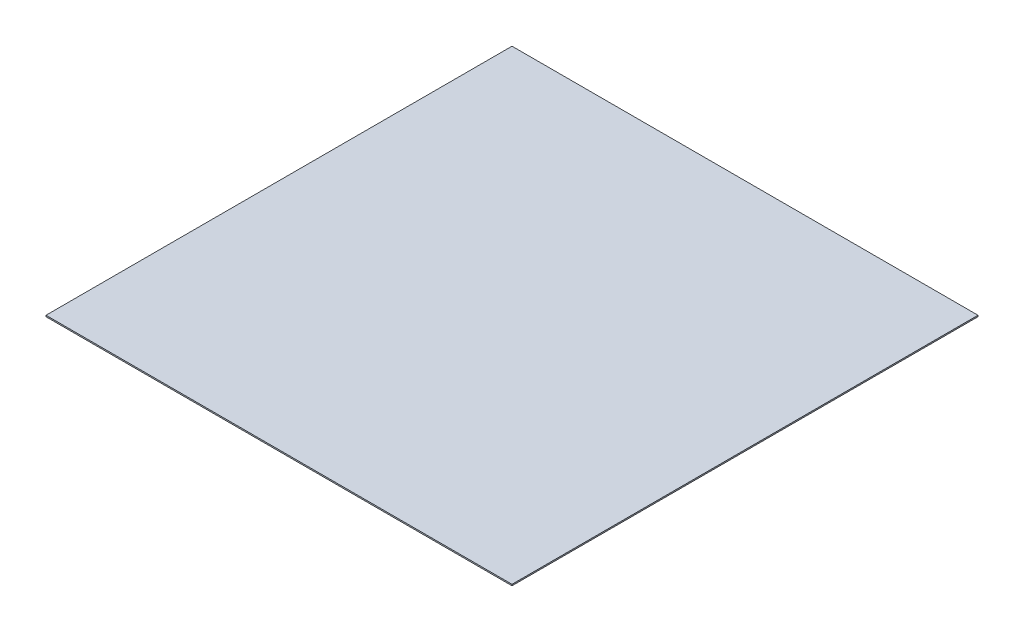
ISO-10303-21;
HEADER;
FILE_DESCRIPTION(('STEP AP214'),'2;1');
FILE_NAME('part.step','',(''),(''),'','','');
FILE_SCHEMA(('AUTOMOTIVE_DESIGN { 1 0 10303 214 1 1 1 1 }'));
ENDSEC;
DATA;
#1=APPLICATION_CONTEXT('core data for automotive mechanical design processes');
#2=APPLICATION_PROTOCOL_DEFINITION('international standard','automotive_design',2000,#1);
#3=PRODUCT_CONTEXT('',#1,'mechanical');
#4=PRODUCT('Part','Part','',(#3));
#5=PRODUCT_RELATED_PRODUCT_CATEGORY('part','',(#4));
#6=PRODUCT_DEFINITION_FORMATION('','',#4);
#7=PRODUCT_DEFINITION_CONTEXT('part definition',#1,'design');
#8=PRODUCT_DEFINITION('design','',#6,#7);
#9=PRODUCT_DEFINITION_SHAPE('','',#8);
#10=(LENGTH_UNIT() NAMED_UNIT(*) SI_UNIT(.MILLI.,.METRE.));
#11=(NAMED_UNIT(*) PLANE_ANGLE_UNIT() SI_UNIT($,.RADIAN.));
#12=(NAMED_UNIT(*) SI_UNIT($,.STERADIAN.) SOLID_ANGLE_UNIT());
#13=UNCERTAINTY_MEASURE_WITH_UNIT(LENGTH_MEASURE(1.E-05),#10,'distance_accuracy_value','');
#14=(GEOMETRIC_REPRESENTATION_CONTEXT(3) GLOBAL_UNCERTAINTY_ASSIGNED_CONTEXT((#13)) GLOBAL_UNIT_ASSIGNED_CONTEXT((#10,
#11,#12)) REPRESENTATION_CONTEXT('',''));
#15=CARTESIAN_POINT('',(0.,0.,0.));
#16=DIRECTION('',(0.,0.,1.));
#17=DIRECTION('',(1.,0.,0.));
#18=AXIS2_PLACEMENT_3D('',#15,#16,#17);
#19=CARTESIAN_POINT('',(1750.,10.,1750.));
#20=DIRECTION('',(-1.,0.,0.));
#21=DIRECTION('',(0.,0.,1.));
#22=AXIS2_PLACEMENT_3D('',#19,#20,#21);
#23=PLANE('',#22);
#24=DIRECTION('',(0.,0.,-1.));
#25=VECTOR('',#24,1.);
#26=CARTESIAN_POINT('',(1750.,0.,1750.));
#27=LINE('',#26,#25);
#28=CARTESIAN_POINT('',(1750.,0.,1750.));
#29=VERTEX_POINT('',#28);
#30=CARTESIAN_POINT('',(1750.,0.,-1750.));
#31=VERTEX_POINT('',#30);
#32=EDGE_CURVE('E98',#29,#31,#27,.T.);
#33=ORIENTED_EDGE('',*,*,#32,.T.);
#34=DIRECTION('',(0.,-1.,0.));
#35=VECTOR('',#34,1.);
#36=CARTESIAN_POINT('',(1750.,10.,-1750.));
#37=LINE('',#36,#35);
#38=CARTESIAN_POINT('',(1750.,10.,-1750.));
#39=VERTEX_POINT('',#38);
#40=EDGE_CURVE('E11',#39,#31,#37,.T.);
#41=ORIENTED_EDGE('',*,*,#40,.F.);
#42=DIRECTION('',(0.,0.,-1.));
#43=VECTOR('',#42,1.);
#44=CARTESIAN_POINT('',(1750.,10.,1750.));
#45=LINE('',#44,#43);
#46=CARTESIAN_POINT('',(1750.,10.,1750.));
#47=VERTEX_POINT('',#46);
#48=EDGE_CURVE('E86',#47,#39,#45,.T.);
#49=ORIENTED_EDGE('',*,*,#48,.F.);
#50=DIRECTION('',(0.,-1.,0.));
#51=VECTOR('',#50,1.);
#52=CARTESIAN_POINT('',(1750.,10.,1750.));
#53=LINE('',#52,#51);
#54=EDGE_CURVE('E94',#47,#29,#53,.T.);
#55=ORIENTED_EDGE('',*,*,#54,.T.);
#56=EDGE_LOOP('',(#33,#41,#49,#55));
#57=FACE_BOUND('',#56,.T.);
#58=ADVANCED_FACE('F35',(#57),#23,.F.);
#59=CARTESIAN_POINT('',(-1750.,10.,-1750.));
#60=DIRECTION('',(0.,0.,1.));
#61=DIRECTION('',(1.,0.,0.));
#62=AXIS2_PLACEMENT_3D('',#59,#60,#61);
#63=PLANE('',#62);
#64=DIRECTION('',(-1.,0.,0.));
#65=VECTOR('',#64,1.);
#66=CARTESIAN_POINT('',(-1750.,0.,-1750.));
#67=LINE('',#66,#65);
#68=CARTESIAN_POINT('',(-1750.,0.,-1750.));
#69=VERTEX_POINT('',#68);
#70=EDGE_CURVE('E90',#31,#69,#67,.T.);
#71=ORIENTED_EDGE('',*,*,#70,.T.);
#72=DIRECTION('',(0.,-1.,0.));
#73=VECTOR('',#72,1.);
#74=CARTESIAN_POINT('',(-1750.,10.,-1750.));
#75=LINE('',#74,#73);
#76=CARTESIAN_POINT('',(-1750.,10.,-1750.));
#77=VERTEX_POINT('',#76);
#78=EDGE_CURVE('E43',#77,#69,#75,.T.);
#79=ORIENTED_EDGE('',*,*,#78,.F.);
#80=DIRECTION('',(-1.,0.,0.));
#81=VECTOR('',#80,1.);
#82=CARTESIAN_POINT('',(-1750.,10.,-1750.));
#83=LINE('',#82,#81);
#84=EDGE_CURVE('E81',#39,#77,#83,.T.);
#85=ORIENTED_EDGE('',*,*,#84,.F.);
#86=ORIENTED_EDGE('',*,*,#40,.T.);
#87=EDGE_LOOP('',(#71,#79,#85,#86));
#88=FACE_BOUND('',#87,.T.);
#89=ADVANCED_FACE('F89',(#88),#63,.F.);
#90=CARTESIAN_POINT('',(-1750.,10.,1750.));
#91=DIRECTION('',(1.,0.,0.));
#92=DIRECTION('',(0.,0.,-1.));
#93=AXIS2_PLACEMENT_3D('',#90,#91,#92);
#94=PLANE('',#93);
#95=DIRECTION('',(0.,0.,1.));
#96=VECTOR('',#95,1.);
#97=CARTESIAN_POINT('',(-1750.,0.,1750.));
#98=LINE('',#97,#96);
#99=CARTESIAN_POINT('',(-1750.,0.,1750.));
#100=VERTEX_POINT('',#99);
#101=EDGE_CURVE('E68',#69,#100,#98,.T.);
#102=ORIENTED_EDGE('',*,*,#101,.T.);
#103=DIRECTION('',(0.,-1.,0.));
#104=VECTOR('',#103,1.);
#105=CARTESIAN_POINT('',(-1750.,10.,1750.));
#106=LINE('',#105,#104);
#107=CARTESIAN_POINT('',(-1750.,10.,1750.));
#108=VERTEX_POINT('',#107);
#109=EDGE_CURVE('E91',#108,#100,#106,.T.);
#110=ORIENTED_EDGE('',*,*,#109,.F.);
#111=DIRECTION('',(0.,0.,1.));
#112=VECTOR('',#111,1.);
#113=CARTESIAN_POINT('',(-1750.,10.,1750.));
#114=LINE('',#113,#112);
#115=EDGE_CURVE('E84',#77,#108,#114,.T.);
#116=ORIENTED_EDGE('',*,*,#115,.F.);
#117=ORIENTED_EDGE('',*,*,#78,.T.);
#118=EDGE_LOOP('',(#102,#110,#116,#117));
#119=FACE_BOUND('',#118,.T.);
#120=ADVANCED_FACE('F92',(#119),#94,.F.);
#121=CARTESIAN_POINT('',(-1750.,10.,1750.));
#122=DIRECTION('',(0.,0.,-1.));
#123=DIRECTION('',(-1.,0.,0.));
#124=AXIS2_PLACEMENT_3D('',#121,#122,#123);
#125=PLANE('',#124);
#126=DIRECTION('',(1.,0.,0.));
#127=VECTOR('',#126,1.);
#128=CARTESIAN_POINT('',(-1750.,0.,1750.));
#129=LINE('',#128,#127);
#130=EDGE_CURVE('E74',#100,#29,#129,.T.);
#131=ORIENTED_EDGE('',*,*,#130,.T.);
#132=ORIENTED_EDGE('',*,*,#54,.F.);
#133=DIRECTION('',(1.,0.,0.));
#134=VECTOR('',#133,1.);
#135=CARTESIAN_POINT('',(-1750.,10.,1750.));
#136=LINE('',#135,#134);
#137=EDGE_CURVE('E51',#108,#47,#136,.T.);
#138=ORIENTED_EDGE('',*,*,#137,.F.);
#139=ORIENTED_EDGE('',*,*,#109,.T.);
#140=EDGE_LOOP('',(#131,#132,#138,#139));
#141=FACE_BOUND('',#140,.T.);
#142=ADVANCED_FACE('F105',(#141),#125,.F.);
#143=CARTESIAN_POINT('',(0.,10.,0.));
#144=DIRECTION('',(0.,-1.,0.));
#145=DIRECTION('',(0.,0.,-1.));
#146=AXIS2_PLACEMENT_3D('',#143,#144,#145);
#147=PLANE('',#146);
#148=ORIENTED_EDGE('',*,*,#48,.T.);
#149=ORIENTED_EDGE('',*,*,#84,.T.);
#150=ORIENTED_EDGE('',*,*,#115,.T.);
#151=ORIENTED_EDGE('',*,*,#137,.T.);
#152=EDGE_LOOP('',(#148,#149,#150,#151));
#153=FACE_BOUND('',#152,.T.);
#154=ADVANCED_FACE('F82',(#153),#147,.F.);
#155=CARTESIAN_POINT('',(0.,0.,0.));
#156=DIRECTION('',(0.,-1.,0.));
#157=DIRECTION('',(0.,0.,-1.));
#158=AXIS2_PLACEMENT_3D('',#155,#156,#157);
#159=PLANE('',#158);
#160=ORIENTED_EDGE('',*,*,#32,.F.);
#161=ORIENTED_EDGE('',*,*,#130,.F.);
#162=ORIENTED_EDGE('',*,*,#101,.F.);
#163=ORIENTED_EDGE('',*,*,#70,.F.);
#164=EDGE_LOOP('',(#160,#161,#162,#163));
#165=FACE_BOUND('',#164,.T.);
#166=ADVANCED_FACE('F108',(#165),#159,.T.);
#167=CLOSED_SHELL('',(#58,#89,#120,#142,#154,#166));
#168=MANIFOLD_SOLID_BREP('B2',#167);
#169=ADVANCED_BREP_SHAPE_REPRESENTATION('',(#18,#168),#14);
#170=SHAPE_DEFINITION_REPRESENTATION(#9,#169);
ENDSEC;
END-ISO-10303-21;
